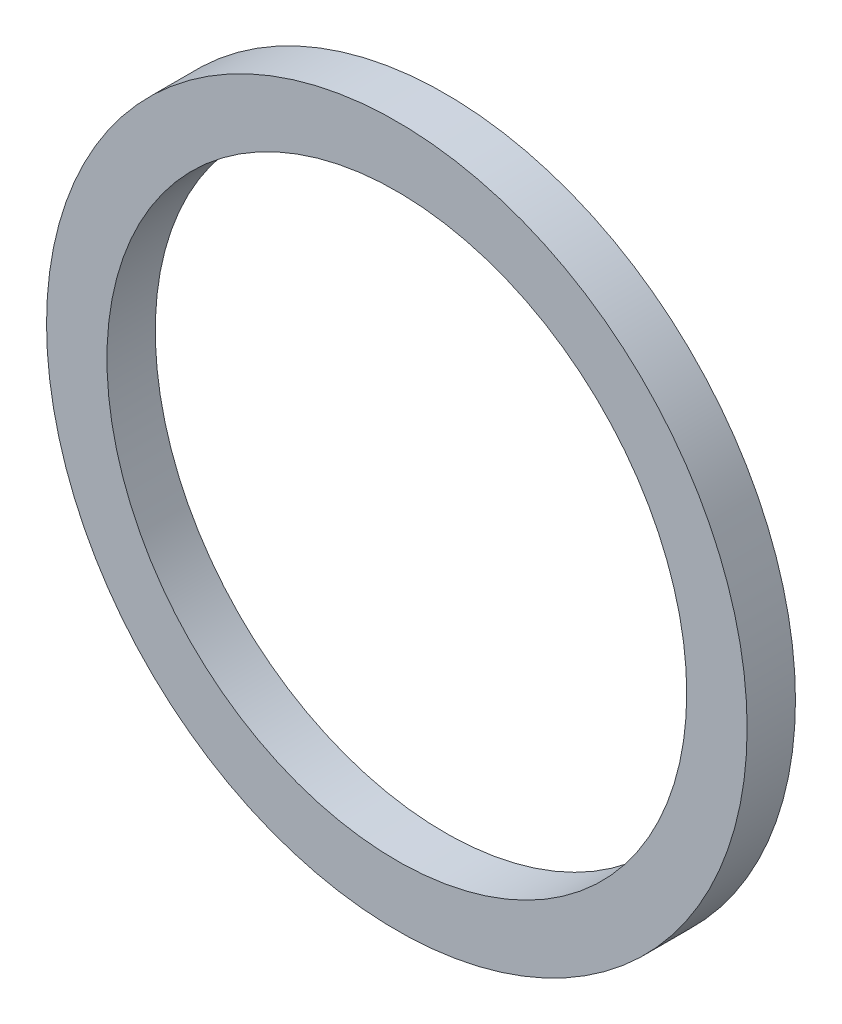
ISO-10303-21;
HEADER;
FILE_DESCRIPTION(('STEP AP214'),'2;1');
FILE_NAME('part.step','',(''),(''),'','','');
FILE_SCHEMA(('AUTOMOTIVE_DESIGN { 1 0 10303 214 1 1 1 1 }'));
ENDSEC;
DATA;
#1=APPLICATION_CONTEXT('core data for automotive mechanical design processes');
#2=APPLICATION_PROTOCOL_DEFINITION('international standard','automotive_design',2000,#1);
#3=PRODUCT_CONTEXT('',#1,'mechanical');
#4=PRODUCT('Part','Part','',(#3));
#5=PRODUCT_RELATED_PRODUCT_CATEGORY('part','',(#4));
#6=PRODUCT_DEFINITION_FORMATION('','',#4);
#7=PRODUCT_DEFINITION_CONTEXT('part definition',#1,'design');
#8=PRODUCT_DEFINITION('design','',#6,#7);
#9=PRODUCT_DEFINITION_SHAPE('','',#8);
#10=(LENGTH_UNIT() NAMED_UNIT(*) SI_UNIT(.MILLI.,.METRE.));
#11=(NAMED_UNIT(*) PLANE_ANGLE_UNIT() SI_UNIT($,.RADIAN.));
#12=(NAMED_UNIT(*) SI_UNIT($,.STERADIAN.) SOLID_ANGLE_UNIT());
#13=UNCERTAINTY_MEASURE_WITH_UNIT(LENGTH_MEASURE(1.E-05),#10,'distance_accuracy_value','');
#14=(GEOMETRIC_REPRESENTATION_CONTEXT(3) GLOBAL_UNCERTAINTY_ASSIGNED_CONTEXT((#13)) GLOBAL_UNIT_ASSIGNED_CONTEXT((#10,
#11,#12)) REPRESENTATION_CONTEXT('',''));
#15=CARTESIAN_POINT('',(0.,0.,0.));
#16=DIRECTION('',(0.,0.,1.));
#17=DIRECTION('',(1.,0.,0.));
#18=AXIS2_PLACEMENT_3D('',#15,#16,#17);
#19=CARTESIAN_POINT('',(0.,0.,10.));
#20=DIRECTION('',(0.,0.,1.));
#21=DIRECTION('',(1.,0.,0.));
#22=AXIS2_PLACEMENT_3D('',#19,#20,#21);
#23=PLANE('',#22);
#24=CARTESIAN_POINT('',(0.,0.,10.));
#25=DIRECTION('',(0.,0.,1.));
#26=DIRECTION('',(1.,0.,0.));
#27=AXIS2_PLACEMENT_3D('',#24,#25,#26);
#28=CIRCLE('',#27,72.5);
#29=CARTESIAN_POINT('',(72.5,0.,10.));
#30=VERTEX_POINT('',#29);
#31=EDGE_CURVE('E10',#30,#30,#28,.T.);
#32=ORIENTED_EDGE('',*,*,#31,.T.);
#33=EDGE_LOOP('',(#32));
#34=FACE_BOUND('',#33,.T.);
#35=CARTESIAN_POINT('',(0.,0.,10.));
#36=DIRECTION('',(0.,0.,1.));
#37=DIRECTION('',(1.,0.,0.));
#38=AXIS2_PLACEMENT_3D('',#35,#36,#37);
#39=CIRCLE('',#38,60.);
#40=CARTESIAN_POINT('',(60.,0.,10.));
#41=VERTEX_POINT('',#40);
#42=EDGE_CURVE('E41',#41,#41,#39,.T.);
#43=ORIENTED_EDGE('',*,*,#42,.F.);
#44=EDGE_LOOP('',(#43));
#45=FACE_BOUND('',#44,.T.);
#46=ADVANCED_FACE('F30',(#34,#45),#23,.T.);
#47=CARTESIAN_POINT('',(0.,0.,0.));
#48=DIRECTION('',(0.,0.,1.));
#49=DIRECTION('',(1.,0.,0.));
#50=AXIS2_PLACEMENT_3D('',#47,#48,#49);
#51=PLANE('',#50);
#52=CARTESIAN_POINT('',(0.,0.,0.));
#53=DIRECTION('',(0.,0.,1.));
#54=DIRECTION('',(1.,0.,0.));
#55=AXIS2_PLACEMENT_3D('',#52,#53,#54);
#56=CIRCLE('',#55,72.5);
#57=CARTESIAN_POINT('',(72.5,0.,0.));
#58=VERTEX_POINT('',#57);
#59=EDGE_CURVE('E34',#58,#58,#56,.T.);
#60=ORIENTED_EDGE('',*,*,#59,.F.);
#61=EDGE_LOOP('',(#60));
#62=FACE_BOUND('',#61,.T.);
#63=CARTESIAN_POINT('',(0.,0.,0.));
#64=DIRECTION('',(0.,0.,1.));
#65=DIRECTION('',(1.,0.,0.));
#66=AXIS2_PLACEMENT_3D('',#63,#64,#65);
#67=CIRCLE('',#66,60.);
#68=CARTESIAN_POINT('',(60.,0.,0.));
#69=VERTEX_POINT('',#68);
#70=EDGE_CURVE('E43',#69,#69,#67,.T.);
#71=ORIENTED_EDGE('',*,*,#70,.T.);
#72=EDGE_LOOP('',(#71));
#73=FACE_BOUND('',#72,.T.);
#74=ADVANCED_FACE('F53',(#62,#73),#51,.F.);
#75=CARTESIAN_POINT('',(0.,0.,10.));
#76=DIRECTION('',(0.,0.,-1.));
#77=DIRECTION('',(-1.,0.,0.));
#78=AXIS2_PLACEMENT_3D('',#75,#76,#77);
#79=CYLINDRICAL_SURFACE('',#78,72.5);
#80=ORIENTED_EDGE('',*,*,#31,.F.);
#81=EDGE_LOOP('',(#80));
#82=FACE_BOUND('',#81,.T.);
#83=ORIENTED_EDGE('',*,*,#59,.T.);
#84=EDGE_LOOP('',(#83));
#85=FACE_BOUND('',#84,.T.);
#86=ADVANCED_FACE('F32',(#82,#85),#79,.T.);
#87=CARTESIAN_POINT('',(0.,0.,10.));
#88=DIRECTION('',(0.,0.,-1.));
#89=DIRECTION('',(-1.,0.,0.));
#90=AXIS2_PLACEMENT_3D('',#87,#88,#89);
#91=CYLINDRICAL_SURFACE('',#90,60.);
#92=ORIENTED_EDGE('',*,*,#42,.T.);
#93=EDGE_LOOP('',(#92));
#94=FACE_BOUND('',#93,.T.);
#95=ORIENTED_EDGE('',*,*,#70,.F.);
#96=EDGE_LOOP('',(#95));
#97=FACE_BOUND('',#96,.T.);
#98=ADVANCED_FACE('F49',(#94,#97),#91,.F.);
#99=CLOSED_SHELL('',(#46,#74,#86,#98));
#100=MANIFOLD_SOLID_BREP('B2',#99);
#101=ADVANCED_BREP_SHAPE_REPRESENTATION('',(#18,#100),#14);
#102=SHAPE_DEFINITION_REPRESENTATION(#9,#101);
ENDSEC;
END-ISO-10303-21;
